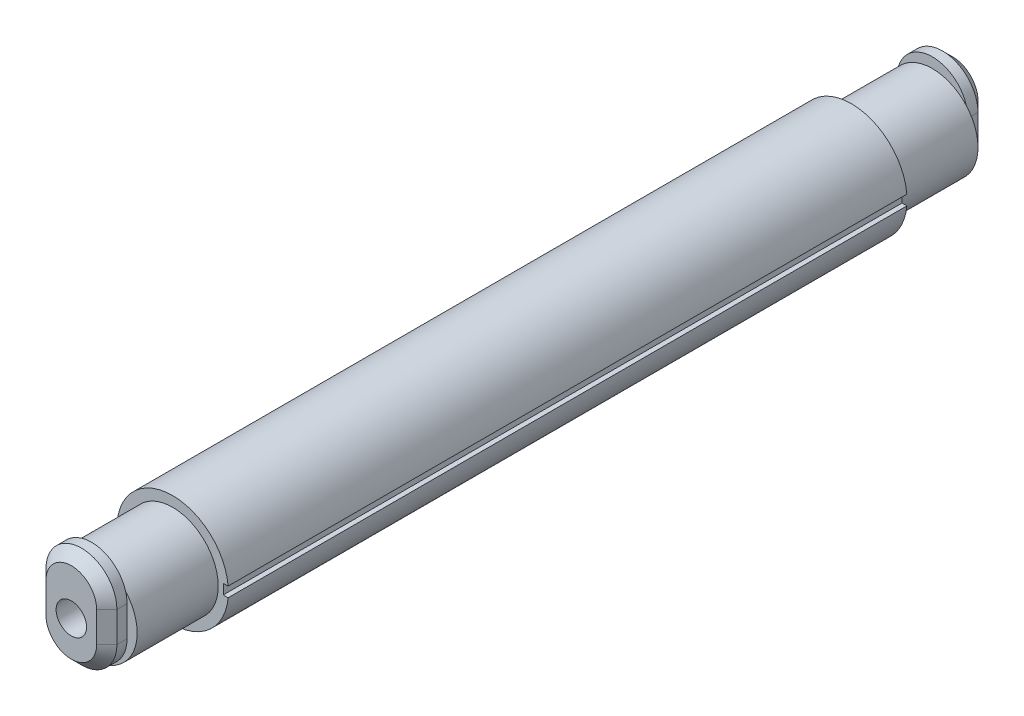
ISO-10303-21;
HEADER;
FILE_DESCRIPTION(('STEP AP214'),'2;1');
FILE_NAME('part.step','',(''),(''),'','','');
FILE_SCHEMA(('AUTOMOTIVE_DESIGN { 1 0 10303 214 1 1 1 1 }'));
ENDSEC;
DATA;
#1=APPLICATION_CONTEXT('core data for automotive mechanical design processes');
#2=APPLICATION_PROTOCOL_DEFINITION('international standard','automotive_design',2000,#1);
#3=PRODUCT_CONTEXT('',#1,'mechanical');
#4=PRODUCT('Part','Part','',(#3));
#5=PRODUCT_RELATED_PRODUCT_CATEGORY('part','',(#4));
#6=PRODUCT_DEFINITION_FORMATION('','',#4);
#7=PRODUCT_DEFINITION_CONTEXT('part definition',#1,'design');
#8=PRODUCT_DEFINITION('design','',#6,#7);
#9=PRODUCT_DEFINITION_SHAPE('','',#8);
#10=(LENGTH_UNIT() NAMED_UNIT(*) SI_UNIT(.MILLI.,.METRE.));
#11=(NAMED_UNIT(*) PLANE_ANGLE_UNIT() SI_UNIT($,.RADIAN.));
#12=(NAMED_UNIT(*) SI_UNIT($,.STERADIAN.) SOLID_ANGLE_UNIT());
#13=UNCERTAINTY_MEASURE_WITH_UNIT(LENGTH_MEASURE(1.E-05),#10,'distance_accuracy_value','');
#14=(GEOMETRIC_REPRESENTATION_CONTEXT(3) GLOBAL_UNCERTAINTY_ASSIGNED_CONTEXT((#13)) GLOBAL_UNIT_ASSIGNED_CONTEXT((#10,
#11,#12)) REPRESENTATION_CONTEXT('',''));
#15=CARTESIAN_POINT('',(0.,0.,0.));
#16=DIRECTION('',(0.,0.,1.));
#17=DIRECTION('',(1.,0.,0.));
#18=AXIS2_PLACEMENT_3D('',#15,#16,#17);
#19=CARTESIAN_POINT('',(0.,0.,-8.));
#20=DIRECTION('',(0.,0.,-1.));
#21=DIRECTION('',(1.,0.,0.));
#22=AXIS2_PLACEMENT_3D('',#19,#20,#21);
#23=PLANE('',#22);
#24=DIRECTION('',(0.,1.,0.));
#25=VECTOR('',#24,1.);
#26=CARTESIAN_POINT('',(3.5,-0.992829401379001,-8.00000000000001));
#27=LINE('',#26,#25);
#28=CARTESIAN_POINT('',(3.5,-0.992829401379001,-8.00000000000001));
#29=VERTEX_POINT('',#28);
#30=CARTESIAN_POINT('',(3.5,2.007170598621,-8.00000000000001));
#31=VERTEX_POINT('',#30);
#32=EDGE_CURVE('E233',#29,#31,#27,.T.);
#33=ORIENTED_EDGE('',*,*,#32,.T.);
#34=CARTESIAN_POINT('',(0.,2.007170598621,-8.00000000000001));
#35=DIRECTION('',(0.,0.,1.));
#36=DIRECTION('',(1.,0.,0.));
#37=AXIS2_PLACEMENT_3D('',#34,#35,#36);
#38=CIRCLE('',#37,3.5);
#39=CARTESIAN_POINT('',(3.35728244613644,2.99644031758754,-8.00000000000001));
#40=VERTEX_POINT('',#39);
#41=EDGE_CURVE('E222',#31,#40,#38,.T.);
#42=ORIENTED_EDGE('',*,*,#41,.T.);
#43=CARTESIAN_POINT('',(0.,0.,-8.));
#44=DIRECTION('',(0.,0.,1.));
#45=DIRECTION('',(1.,0.,0.));
#46=AXIS2_PLACEMENT_3D('',#43,#44,#45);
#47=CIRCLE('',#46,4.5);
#48=CARTESIAN_POINT('',(-3.35728244613644,2.99644031758754,-8.00000000000001));
#49=VERTEX_POINT('',#48);
#50=EDGE_CURVE('E216',#49,#40,#47,.T.);
#51=ORIENTED_EDGE('',*,*,#50,.F.);
#52=CARTESIAN_POINT('',(-3.5,2.007170598621,-8.00000000000001));
#53=VERTEX_POINT('',#52);
#54=EDGE_CURVE('E196',#49,#53,#38,.T.);
#55=ORIENTED_EDGE('',*,*,#54,.T.);
#56=DIRECTION('',(0.,-1.,0.));
#57=VECTOR('',#56,1.);
#58=CARTESIAN_POINT('',(-3.5,-0.992829401379001,-8.00000000000001));
#59=LINE('',#58,#57);
#60=CARTESIAN_POINT('',(-3.5,-0.992829401379001,-8.00000000000001));
#61=VERTEX_POINT('',#60);
#62=EDGE_CURVE('E203',#53,#61,#59,.T.);
#63=ORIENTED_EDGE('',*,*,#62,.T.);
#64=CARTESIAN_POINT('',(0.,-0.992829401379001,-8.00000000000001));
#65=DIRECTION('',(0.,0.,1.));
#66=DIRECTION('',(1.,0.,0.));
#67=AXIS2_PLACEMENT_3D('',#64,#65,#66);
#68=CIRCLE('',#67,3.5);
#69=EDGE_CURVE('E210',#61,#29,#68,.T.);
#70=ORIENTED_EDGE('',*,*,#69,.T.);
#71=EDGE_LOOP('',(#33,#42,#51,#55,#63,#70));
#72=FACE_BOUND('',#71,.T.);
#73=ADVANCED_FACE('F42',(#72),#23,.T.);
#74=CARTESIAN_POINT('',(0.,0.,67.));
#75=DIRECTION('',(0.,0.,-1.));
#76=DIRECTION('',(-1.,0.,0.));
#77=AXIS2_PLACEMENT_3D('',#74,#75,#76);
#78=CYLINDRICAL_SURFACE('',#77,5.5);
#79=CARTESIAN_POINT('',(0.,0.,67.));
#80=DIRECTION('',(0.,0.,1.));
#81=DIRECTION('',(1.,0.,0.));
#82=AXIS2_PLACEMENT_3D('',#79,#80,#81);
#83=CIRCLE('',#82,5.5);
#84=CARTESIAN_POINT('',(-5.47722557505166,-0.5,67.));
#85=VERTEX_POINT('',#84);
#86=CARTESIAN_POINT('',(5.47722557505166,-0.5,67.));
#87=VERTEX_POINT('',#86);
#88=EDGE_CURVE('E369',#85,#87,#83,.T.);
#89=ORIENTED_EDGE('',*,*,#88,.F.);
#90=DIRECTION('',(0.,0.,-1.));
#91=VECTOR('',#90,1.);
#92=CARTESIAN_POINT('',(-5.47722557505166,-0.5,67.));
#93=LINE('',#92,#91);
#94=CARTESIAN_POINT('',(-5.47722557505166,-0.5,0.));
#95=VERTEX_POINT('',#94);
#96=EDGE_CURVE('E359',#85,#95,#93,.T.);
#97=ORIENTED_EDGE('',*,*,#96,.T.);
#98=CARTESIAN_POINT('',(0.,0.,0.));
#99=DIRECTION('',(0.,0.,1.));
#100=DIRECTION('',(1.,0.,0.));
#101=AXIS2_PLACEMENT_3D('',#98,#99,#100);
#102=CIRCLE('',#101,5.5);
#103=CARTESIAN_POINT('',(5.47722557505166,-0.5,0.));
#104=VERTEX_POINT('',#103);
#105=EDGE_CURVE('E363',#95,#104,#102,.T.);
#106=ORIENTED_EDGE('',*,*,#105,.T.);
#107=DIRECTION('',(0.,0.,-1.));
#108=VECTOR('',#107,1.);
#109=CARTESIAN_POINT('',(5.47722557505166,-0.5,67.));
#110=LINE('',#109,#108);
#111=EDGE_CURVE('E351',#104,#87,#110,.F.);
#112=ORIENTED_EDGE('',*,*,#111,.T.);
#113=EDGE_LOOP('',(#89,#97,#106,#112));
#114=FACE_BOUND('',#113,.T.);
#115=ADVANCED_FACE('F506',(#114),#78,.T.);
#116=CARTESIAN_POINT('',(5.47722557505166,0.5,0.));
#117=VERTEX_POINT('',#116);
#118=CARTESIAN_POINT('',(-5.47722557505166,0.5,0.));
#119=VERTEX_POINT('',#118);
#120=EDGE_CURVE('E370',#117,#119,#102,.T.);
#121=ORIENTED_EDGE('',*,*,#120,.T.);
#122=DIRECTION('',(0.,0.,-1.));
#123=VECTOR('',#122,1.);
#124=CARTESIAN_POINT('',(-5.47722557505166,0.5,67.));
#125=LINE('',#124,#123);
#126=CARTESIAN_POINT('',(-5.47722557505166,0.5,67.));
#127=VERTEX_POINT('',#126);
#128=EDGE_CURVE('E355',#119,#127,#125,.F.);
#129=ORIENTED_EDGE('',*,*,#128,.T.);
#130=CARTESIAN_POINT('',(5.47722557505166,0.5,67.));
#131=VERTEX_POINT('',#130);
#132=EDGE_CURVE('E364',#131,#127,#83,.T.);
#133=ORIENTED_EDGE('',*,*,#132,.F.);
#134=DIRECTION('',(0.,0.,-1.));
#135=VECTOR('',#134,1.);
#136=CARTESIAN_POINT('',(5.47722557505166,0.5,67.));
#137=LINE('',#136,#135);
#138=EDGE_CURVE('E320',#131,#117,#137,.T.);
#139=ORIENTED_EDGE('',*,*,#138,.T.);
#140=EDGE_LOOP('',(#121,#129,#133,#139));
#141=FACE_BOUND('',#140,.T.);
#142=ADVANCED_FACE('F511',(#141),#78,.T.);
#143=CARTESIAN_POINT('',(0.,0.,67.));
#144=DIRECTION('',(0.,0.,1.));
#145=DIRECTION('',(1.,0.,0.));
#146=AXIS2_PLACEMENT_3D('',#143,#144,#145);
#147=PLANE('',#146);
#148=CARTESIAN_POINT('',(0.,0.,67.));
#149=DIRECTION('',(0.,0.,1.));
#150=DIRECTION('',(1.,0.,0.));
#151=AXIS2_PLACEMENT_3D('',#148,#149,#150);
#152=CIRCLE('',#151,4.5);
#153=CARTESIAN_POINT('',(4.5,0.,67.));
#154=VERTEX_POINT('',#153);
#155=EDGE_CURVE('E286',#154,#154,#152,.T.);
#156=ORIENTED_EDGE('',*,*,#155,.F.);
#157=EDGE_LOOP('',(#156));
#158=FACE_BOUND('',#157,.T.);
#159=DIRECTION('',(-1.,0.,0.));
#160=VECTOR('',#159,1.);
#161=CARTESIAN_POINT('',(-5.,-0.5,67.));
#162=LINE('',#161,#160);
#163=CARTESIAN_POINT('',(-5.,-0.5,67.));
#164=VERTEX_POINT('',#163);
#165=EDGE_CURVE('E305',#164,#85,#162,.T.);
#166=ORIENTED_EDGE('',*,*,#165,.T.);
#167=ORIENTED_EDGE('',*,*,#88,.T.);
#168=DIRECTION('',(-1.,0.,0.));
#169=VECTOR('',#168,1.);
#170=CARTESIAN_POINT('',(6.,-0.5,67.));
#171=LINE('',#170,#169);
#172=CARTESIAN_POINT('',(5.,-0.5,67.));
#173=VERTEX_POINT('',#172);
#174=EDGE_CURVE('E333',#87,#173,#171,.T.);
#175=ORIENTED_EDGE('',*,*,#174,.T.);
#176=DIRECTION('',(0.,1.,0.));
#177=VECTOR('',#176,1.);
#178=CARTESIAN_POINT('',(5.,0.5,67.));
#179=LINE('',#178,#177);
#180=CARTESIAN_POINT('',(5.,0.5,67.));
#181=VERTEX_POINT('',#180);
#182=EDGE_CURVE('E324',#173,#181,#179,.T.);
#183=ORIENTED_EDGE('',*,*,#182,.T.);
#184=DIRECTION('',(1.,0.,0.));
#185=VECTOR('',#184,1.);
#186=CARTESIAN_POINT('',(6.,0.5,67.));
#187=LINE('',#186,#185);
#188=EDGE_CURVE('E328',#181,#131,#187,.T.);
#189=ORIENTED_EDGE('',*,*,#188,.T.);
#190=ORIENTED_EDGE('',*,*,#132,.T.);
#191=DIRECTION('',(1.,0.,0.));
#192=VECTOR('',#191,1.);
#193=CARTESIAN_POINT('',(-5.,0.5,67.));
#194=LINE('',#193,#192);
#195=CARTESIAN_POINT('',(-5.,0.5,67.));
#196=VERTEX_POINT('',#195);
#197=EDGE_CURVE('E296',#127,#196,#194,.T.);
#198=ORIENTED_EDGE('',*,*,#197,.T.);
#199=DIRECTION('',(0.,-1.,0.));
#200=VECTOR('',#199,1.);
#201=CARTESIAN_POINT('',(-5.,0.5,67.));
#202=LINE('',#201,#200);
#203=EDGE_CURVE('E300',#196,#164,#202,.T.);
#204=ORIENTED_EDGE('',*,*,#203,.T.);
#205=EDGE_LOOP('',(#166,#167,#175,#183,#189,#190,#198,#204));
#206=FACE_BOUND('',#205,.T.);
#207=ADVANCED_FACE('F578',(#158,#206),#147,.T.);
#208=CARTESIAN_POINT('',(0.,0.,0.));
#209=DIRECTION('',(0.,0.,1.));
#210=DIRECTION('',(1.,0.,0.));
#211=AXIS2_PLACEMENT_3D('',#208,#209,#210);
#212=PLANE('',#211);
#213=CARTESIAN_POINT('',(0.,0.,0.));
#214=DIRECTION('',(0.,0.,1.));
#215=DIRECTION('',(1.,0.,0.));
#216=AXIS2_PLACEMENT_3D('',#213,#214,#215);
#217=CIRCLE('',#216,4.5);
#218=CARTESIAN_POINT('',(4.5,0.,0.));
#219=VERTEX_POINT('',#218);
#220=EDGE_CURVE('E245',#219,#219,#217,.T.);
#221=ORIENTED_EDGE('',*,*,#220,.T.);
#222=EDGE_LOOP('',(#221));
#223=FACE_BOUND('',#222,.T.);
#224=ORIENTED_EDGE('',*,*,#105,.F.);
#225=DIRECTION('',(-1.,0.,0.));
#226=VECTOR('',#225,1.);
#227=CARTESIAN_POINT('',(-5.,-0.5,0.));
#228=LINE('',#227,#226);
#229=CARTESIAN_POINT('',(-5.,-0.5,0.));
#230=VERTEX_POINT('',#229);
#231=EDGE_CURVE('E301',#230,#95,#228,.T.);
#232=ORIENTED_EDGE('',*,*,#231,.F.);
#233=DIRECTION('',(0.,-1.,0.));
#234=VECTOR('',#233,1.);
#235=CARTESIAN_POINT('',(-5.,0.5,0.));
#236=LINE('',#235,#234);
#237=CARTESIAN_POINT('',(-5.,0.5,0.));
#238=VERTEX_POINT('',#237);
#239=EDGE_CURVE('E310',#238,#230,#236,.T.);
#240=ORIENTED_EDGE('',*,*,#239,.F.);
#241=DIRECTION('',(-1.,0.,0.));
#242=VECTOR('',#241,1.);
#243=CARTESIAN_POINT('',(0.,0.5,0.));
#244=LINE('',#243,#242);
#245=EDGE_CURVE('E377',#238,#119,#244,.T.);
#246=ORIENTED_EDGE('',*,*,#245,.T.);
#247=ORIENTED_EDGE('',*,*,#120,.F.);
#248=DIRECTION('',(1.,0.,0.));
#249=VECTOR('',#248,1.);
#250=CARTESIAN_POINT('',(6.,0.5,0.));
#251=LINE('',#250,#249);
#252=CARTESIAN_POINT('',(5.,0.5,0.));
#253=VERTEX_POINT('',#252);
#254=EDGE_CURVE('E329',#253,#117,#251,.T.);
#255=ORIENTED_EDGE('',*,*,#254,.F.);
#256=DIRECTION('',(0.,1.,0.));
#257=VECTOR('',#256,1.);
#258=CARTESIAN_POINT('',(5.,0.5,0.));
#259=LINE('',#258,#257);
#260=CARTESIAN_POINT('',(5.,-0.5,0.));
#261=VERTEX_POINT('',#260);
#262=EDGE_CURVE('E291',#261,#253,#259,.T.);
#263=ORIENTED_EDGE('',*,*,#262,.F.);
#264=DIRECTION('',(1.,0.,0.));
#265=VECTOR('',#264,1.);
#266=CARTESIAN_POINT('',(0.,-0.5,0.));
#267=LINE('',#266,#265);
#268=EDGE_CURVE('E368',#261,#104,#267,.T.);
#269=ORIENTED_EDGE('',*,*,#268,.T.);
#270=EDGE_LOOP('',(#224,#232,#240,#246,#247,#255,#263,#269));
#271=FACE_BOUND('',#270,.T.);
#272=ADVANCED_FACE('F570',(#223,#271),#212,.F.);
#273=CARTESIAN_POINT('',(6.,-0.5,67.));
#274=DIRECTION('',(0.,-1.,0.));
#275=DIRECTION('',(0.,0.,-1.));
#276=AXIS2_PLACEMENT_3D('',#273,#274,#275);
#277=PLANE('',#276);
#278=ORIENTED_EDGE('',*,*,#268,.F.);
#279=DIRECTION('',(0.,0.,-1.));
#280=VECTOR('',#279,1.);
#281=CARTESIAN_POINT('',(5.,-0.5,67.));
#282=LINE('',#281,#280);
#283=EDGE_CURVE('E314',#173,#261,#282,.T.);
#284=ORIENTED_EDGE('',*,*,#283,.F.);
#285=ORIENTED_EDGE('',*,*,#174,.F.);
#286=ORIENTED_EDGE('',*,*,#111,.F.);
#287=EDGE_LOOP('',(#278,#284,#285,#286));
#288=FACE_BOUND('',#287,.T.);
#289=ADVANCED_FACE('F566',(#288),#277,.F.);
#290=CARTESIAN_POINT('',(6.,0.5,67.));
#291=DIRECTION('',(0.,1.,0.));
#292=DIRECTION('',(0.,0.,1.));
#293=AXIS2_PLACEMENT_3D('',#290,#291,#292);
#294=PLANE('',#293);
#295=ORIENTED_EDGE('',*,*,#188,.F.);
#296=DIRECTION('',(0.,0.,-1.));
#297=VECTOR('',#296,1.);
#298=CARTESIAN_POINT('',(5.,0.5,67.));
#299=LINE('',#298,#297);
#300=EDGE_CURVE('E337',#181,#253,#299,.T.);
#301=ORIENTED_EDGE('',*,*,#300,.T.);
#302=ORIENTED_EDGE('',*,*,#254,.T.);
#303=ORIENTED_EDGE('',*,*,#138,.F.);
#304=EDGE_LOOP('',(#295,#301,#302,#303));
#305=FACE_BOUND('',#304,.T.);
#306=ADVANCED_FACE('F569',(#305),#294,.F.);
#307=CARTESIAN_POINT('',(5.,0.5,67.));
#308=DIRECTION('',(-1.,0.,0.));
#309=DIRECTION('',(0.,0.,1.));
#310=AXIS2_PLACEMENT_3D('',#307,#308,#309);
#311=PLANE('',#310);
#312=ORIENTED_EDGE('',*,*,#262,.T.);
#313=ORIENTED_EDGE('',*,*,#300,.F.);
#314=ORIENTED_EDGE('',*,*,#182,.F.);
#315=ORIENTED_EDGE('',*,*,#283,.T.);
#316=EDGE_LOOP('',(#312,#313,#314,#315));
#317=FACE_BOUND('',#316,.T.);
#318=ADVANCED_FACE('F558',(#317),#311,.F.);
#319=CARTESIAN_POINT('',(-5.,-0.5,67.));
#320=DIRECTION('',(0.,-1.,0.));
#321=DIRECTION('',(0.,0.,-1.));
#322=AXIS2_PLACEMENT_3D('',#319,#320,#321);
#323=PLANE('',#322);
#324=ORIENTED_EDGE('',*,*,#165,.F.);
#325=DIRECTION('',(0.,0.,-1.));
#326=VECTOR('',#325,1.);
#327=CARTESIAN_POINT('',(-5.,-0.5,67.));
#328=LINE('',#327,#326);
#329=EDGE_CURVE('E317',#164,#230,#328,.T.);
#330=ORIENTED_EDGE('',*,*,#329,.T.);
#331=ORIENTED_EDGE('',*,*,#231,.T.);
#332=ORIENTED_EDGE('',*,*,#96,.F.);
#333=EDGE_LOOP('',(#324,#330,#331,#332));
#334=FACE_BOUND('',#333,.T.);
#335=ADVANCED_FACE('F554',(#334),#323,.F.);
#336=CARTESIAN_POINT('',(-5.,0.5,67.));
#337=DIRECTION('',(0.,1.,0.));
#338=DIRECTION('',(0.,0.,1.));
#339=AXIS2_PLACEMENT_3D('',#336,#337,#338);
#340=PLANE('',#339);
#341=ORIENTED_EDGE('',*,*,#245,.F.);
#342=DIRECTION('',(0.,0.,-1.));
#343=VECTOR('',#342,1.);
#344=CARTESIAN_POINT('',(-5.,0.5,67.));
#345=LINE('',#344,#343);
#346=EDGE_CURVE('E309',#196,#238,#345,.T.);
#347=ORIENTED_EDGE('',*,*,#346,.F.);
#348=ORIENTED_EDGE('',*,*,#197,.F.);
#349=ORIENTED_EDGE('',*,*,#128,.F.);
#350=EDGE_LOOP('',(#341,#347,#348,#349));
#351=FACE_BOUND('',#350,.T.);
#352=ADVANCED_FACE('F557',(#351),#340,.F.);
#353=CARTESIAN_POINT('',(-5.,0.5,67.));
#354=DIRECTION('',(1.,0.,0.));
#355=DIRECTION('',(0.,0.,-1.));
#356=AXIS2_PLACEMENT_3D('',#353,#354,#355);
#357=PLANE('',#356);
#358=ORIENTED_EDGE('',*,*,#239,.T.);
#359=ORIENTED_EDGE('',*,*,#329,.F.);
#360=ORIENTED_EDGE('',*,*,#203,.F.);
#361=ORIENTED_EDGE('',*,*,#346,.T.);
#362=EDGE_LOOP('',(#358,#359,#360,#361));
#363=FACE_BOUND('',#362,.T.);
#364=ADVANCED_FACE('F552',(#363),#357,.F.);
#365=CARTESIAN_POINT('',(0.,0.,75.));
#366=DIRECTION('',(0.,0.,-1.));
#367=DIRECTION('',(-1.,0.,0.));
#368=AXIS2_PLACEMENT_3D('',#365,#366,#367);
#369=CYLINDRICAL_SURFACE('',#368,4.5);
#370=CARTESIAN_POINT('',(0.,0.,75.));
#371=DIRECTION('',(0.,0.,1.));
#372=DIRECTION('',(1.,0.,0.));
#373=AXIS2_PLACEMENT_3D('',#370,#371,#372);
#374=CIRCLE('',#373,4.5);
#375=CARTESIAN_POINT('',(3.35728244613644,2.99644031758754,75.));
#376=VERTEX_POINT('',#375);
#377=CARTESIAN_POINT('',(-3.35728244613644,2.99644031758754,75.));
#378=VERTEX_POINT('',#377);
#379=EDGE_CURVE('E287',#376,#378,#374,.T.);
#380=ORIENTED_EDGE('',*,*,#379,.F.);
#381=EDGE_CURVE('E292',#378,#376,#374,.T.);
#382=ORIENTED_EDGE('',*,*,#381,.F.);
#383=EDGE_LOOP('',(#380,#382));
#384=FACE_BOUND('',#383,.T.);
#385=ORIENTED_EDGE('',*,*,#155,.T.);
#386=EDGE_LOOP('',(#385));
#387=FACE_BOUND('',#386,.T.);
#388=ADVANCED_FACE('F548',(#384,#387),#369,.T.);
#389=CARTESIAN_POINT('',(0.,0.,75.));
#390=DIRECTION('',(0.,0.,1.));
#391=DIRECTION('',(1.,0.,0.));
#392=AXIS2_PLACEMENT_3D('',#389,#390,#391);
#393=PLANE('',#392);
#394=CARTESIAN_POINT('',(0.,2.007170598621,75.));
#395=DIRECTION('',(0.,0.,1.));
#396=DIRECTION('',(1.,0.,0.));
#397=AXIS2_PLACEMENT_3D('',#394,#395,#396);
#398=CIRCLE('',#397,3.5);
#399=CARTESIAN_POINT('',(-3.5,2.007170598621,75.));
#400=VERTEX_POINT('',#399);
#401=EDGE_CURVE('E270',#378,#400,#398,.T.);
#402=ORIENTED_EDGE('',*,*,#401,.F.);
#403=ORIENTED_EDGE('',*,*,#381,.T.);
#404=CARTESIAN_POINT('',(3.5,2.007170598621,75.));
#405=VERTEX_POINT('',#404);
#406=EDGE_CURVE('E265',#405,#376,#398,.T.);
#407=ORIENTED_EDGE('',*,*,#406,.F.);
#408=DIRECTION('',(0.,1.,0.));
#409=VECTOR('',#408,1.);
#410=CARTESIAN_POINT('',(3.5,-0.992829401379001,75.));
#411=LINE('',#410,#409);
#412=CARTESIAN_POINT('',(3.5,-0.992829401379001,75.));
#413=VERTEX_POINT('',#412);
#414=EDGE_CURVE('E259',#413,#405,#411,.T.);
#415=ORIENTED_EDGE('',*,*,#414,.F.);
#416=CARTESIAN_POINT('',(0.,-0.992829401379001,75.));
#417=DIRECTION('',(0.,0.,1.));
#418=DIRECTION('',(1.,0.,0.));
#419=AXIS2_PLACEMENT_3D('',#416,#417,#418);
#420=CIRCLE('',#419,3.5);
#421=CARTESIAN_POINT('',(-3.5,-0.992829401379001,75.));
#422=VERTEX_POINT('',#421);
#423=EDGE_CURVE('E255',#422,#413,#420,.T.);
#424=ORIENTED_EDGE('',*,*,#423,.F.);
#425=DIRECTION('',(0.,-1.,0.));
#426=VECTOR('',#425,1.);
#427=CARTESIAN_POINT('',(-3.5,-0.992829401379001,75.));
#428=LINE('',#427,#426);
#429=EDGE_CURVE('E269',#400,#422,#428,.T.);
#430=ORIENTED_EDGE('',*,*,#429,.F.);
#431=EDGE_LOOP('',(#402,#403,#407,#415,#424,#430));
#432=FACE_BOUND('',#431,.T.);
#433=ADVANCED_FACE('F530',(#432),#393,.T.);
#434=CARTESIAN_POINT('',(0.,-0.992829401379001,75.));
#435=DIRECTION('',(0.,0.,1.));
#436=DIRECTION('',(1.,0.,0.));
#437=AXIS2_PLACEMENT_3D('',#434,#435,#436);
#438=PLANE('',#437);
#439=EDGE_CURVE('E264',#376,#378,#398,.T.);
#440=ORIENTED_EDGE('',*,*,#439,.F.);
#441=ORIENTED_EDGE('',*,*,#379,.T.);
#442=EDGE_LOOP('',(#440,#441));
#443=FACE_BOUND('',#442,.T.);
#444=ADVANCED_FACE('F526',(#443),#438,.F.);
#445=CARTESIAN_POINT('',(0.,-0.992829401379001,77.));
#446=DIRECTION('',(0.,0.,-1.));
#447=DIRECTION('',(-1.,0.,0.));
#448=AXIS2_PLACEMENT_3D('',#445,#446,#447);
#449=CYLINDRICAL_SURFACE('',#448,3.5);
#450=DIRECTION('',(0.,0.,-1.));
#451=VECTOR('',#450,1.);
#452=CARTESIAN_POINT('',(3.5,-0.992829401379001,77.));
#453=LINE('',#452,#451);
#454=CARTESIAN_POINT('',(3.5,-0.992829401379001,76.));
#455=VERTEX_POINT('',#454);
#456=EDGE_CURVE('E283',#455,#413,#453,.T.);
#457=ORIENTED_EDGE('',*,*,#456,.F.);
#458=CARTESIAN_POINT('',(0.,-0.992829401379001,76.));
#459=DIRECTION('',(0.,0.,1.));
#460=DIRECTION('',(1.,0.,0.));
#461=AXIS2_PLACEMENT_3D('',#458,#459,#460);
#462=CIRCLE('',#461,3.5);
#463=CARTESIAN_POINT('',(-3.5,-0.992829401379001,76.));
#464=VERTEX_POINT('',#463);
#465=EDGE_CURVE('E229',#455,#464,#462,.F.);
#466=ORIENTED_EDGE('',*,*,#465,.T.);
#467=DIRECTION('',(0.,0.,-1.));
#468=VECTOR('',#467,1.);
#469=CARTESIAN_POINT('',(-3.5,-0.992829401379001,77.));
#470=LINE('',#469,#468);
#471=EDGE_CURVE('E274',#464,#422,#470,.T.);
#472=ORIENTED_EDGE('',*,*,#471,.T.);
#473=ORIENTED_EDGE('',*,*,#423,.T.);
#474=EDGE_LOOP('',(#457,#466,#472,#473));
#475=FACE_BOUND('',#474,.T.);
#476=ADVANCED_FACE('F529',(#475),#449,.T.);
#477=CARTESIAN_POINT('',(3.5,-0.992829401379001,77.));
#478=DIRECTION('',(-1.,0.,0.));
#479=DIRECTION('',(0.,-1.,0.));
#480=AXIS2_PLACEMENT_3D('',#477,#478,#479);
#481=PLANE('',#480);
#482=DIRECTION('',(0.,0.,-1.));
#483=VECTOR('',#482,1.);
#484=CARTESIAN_POINT('',(3.5,2.007170598621,77.));
#485=LINE('',#484,#483);
#486=CARTESIAN_POINT('',(3.5,2.007170598621,76.));
#487=VERTEX_POINT('',#486);
#488=EDGE_CURVE('E280',#487,#405,#485,.T.);
#489=ORIENTED_EDGE('',*,*,#488,.F.);
#490=DIRECTION('',(0.,-1.,0.));
#491=VECTOR('',#490,1.);
#492=CARTESIAN_POINT('',(3.5,-0.992829401379001,76.));
#493=LINE('',#492,#491);
#494=EDGE_CURVE('E394',#487,#455,#493,.T.);
#495=ORIENTED_EDGE('',*,*,#494,.T.);
#496=ORIENTED_EDGE('',*,*,#456,.T.);
#497=ORIENTED_EDGE('',*,*,#414,.T.);
#498=EDGE_LOOP('',(#489,#495,#496,#497));
#499=FACE_BOUND('',#498,.T.);
#500=ADVANCED_FACE('F538',(#499),#481,.F.);
#501=CARTESIAN_POINT('',(0.,2.007170598621,77.));
#502=DIRECTION('',(0.,0.,-1.));
#503=DIRECTION('',(-1.,0.,0.));
#504=AXIS2_PLACEMENT_3D('',#501,#502,#503);
#505=CYLINDRICAL_SURFACE('',#504,3.5);
#506=DIRECTION('',(0.,0.,-1.));
#507=VECTOR('',#506,1.);
#508=CARTESIAN_POINT('',(-3.5,2.007170598621,77.));
#509=LINE('',#508,#507);
#510=CARTESIAN_POINT('',(-3.5,2.007170598621,76.));
#511=VERTEX_POINT('',#510);
#512=EDGE_CURVE('E277',#511,#400,#509,.T.);
#513=ORIENTED_EDGE('',*,*,#512,.F.);
#514=CARTESIAN_POINT('',(0.,2.007170598621,76.));
#515=DIRECTION('',(0.,0.,1.));
#516=DIRECTION('',(1.,0.,0.));
#517=AXIS2_PLACEMENT_3D('',#514,#515,#516);
#518=CIRCLE('',#517,3.5);
#519=EDGE_CURVE('E398',#511,#487,#518,.F.);
#520=ORIENTED_EDGE('',*,*,#519,.T.);
#521=ORIENTED_EDGE('',*,*,#488,.T.);
#522=ORIENTED_EDGE('',*,*,#406,.T.);
#523=ORIENTED_EDGE('',*,*,#439,.T.);
#524=ORIENTED_EDGE('',*,*,#401,.T.);
#525=EDGE_LOOP('',(#513,#520,#521,#522,#523,#524));
#526=FACE_BOUND('',#525,.T.);
#527=ADVANCED_FACE('F534',(#526),#505,.T.);
#528=CARTESIAN_POINT('',(-3.5,-0.992829401379001,77.));
#529=DIRECTION('',(1.,0.,0.));
#530=DIRECTION('',(0.,1.,0.));
#531=AXIS2_PLACEMENT_3D('',#528,#529,#530);
#532=PLANE('',#531);
#533=ORIENTED_EDGE('',*,*,#471,.F.);
#534=DIRECTION('',(0.,1.,0.));
#535=VECTOR('',#534,1.);
#536=CARTESIAN_POINT('',(-3.5,2.007170598621,76.));
#537=LINE('',#536,#535);
#538=EDGE_CURVE('E220',#464,#511,#537,.T.);
#539=ORIENTED_EDGE('',*,*,#538,.T.);
#540=ORIENTED_EDGE('',*,*,#512,.T.);
#541=ORIENTED_EDGE('',*,*,#429,.T.);
#542=EDGE_LOOP('',(#533,#539,#540,#541));
#543=FACE_BOUND('',#542,.T.);
#544=ADVANCED_FACE('F524',(#543),#532,.F.);
#545=CARTESIAN_POINT('',(0.,-0.992829401379001,77.));
#546=DIRECTION('',(0.,0.,1.));
#547=DIRECTION('',(1.,0.,0.));
#548=AXIS2_PLACEMENT_3D('',#545,#546,#547);
#549=PLANE('',#548);
#550=CARTESIAN_POINT('',(0.,0.,77.));
#551=DIRECTION('',(0.,0.,-1.));
#552=DIRECTION('',(-1.,0.,0.));
#553=AXIS2_PLACEMENT_3D('',#550,#551,#552);
#554=CIRCLE('',#553,1.49999999999998);
#555=CARTESIAN_POINT('',(-1.49999999999998,0.,77.));
#556=VERTEX_POINT('',#555);
#557=EDGE_CURVE('E435',#556,#556,#554,.T.);
#558=ORIENTED_EDGE('',*,*,#557,.T.);
#559=EDGE_LOOP('',(#558));
#560=FACE_BOUND('',#559,.T.);
#561=CARTESIAN_POINT('',(0.,-0.992829401379001,77.));
#562=DIRECTION('',(0.,0.,1.));
#563=DIRECTION('',(1.,0.,0.));
#564=AXIS2_PLACEMENT_3D('',#561,#562,#563);
#565=CIRCLE('',#564,2.5);
#566=CARTESIAN_POINT('',(-2.5,-0.992829401379001,77.));
#567=VERTEX_POINT('',#566);
#568=CARTESIAN_POINT('',(2.5,-0.992829401379,77.));
#569=VERTEX_POINT('',#568);
#570=EDGE_CURVE('E384',#567,#569,#565,.T.);
#571=ORIENTED_EDGE('',*,*,#570,.T.);
#572=DIRECTION('',(0.,1.,0.));
#573=VECTOR('',#572,1.);
#574=CARTESIAN_POINT('',(2.5,2.007170598621,77.));
#575=LINE('',#574,#573);
#576=CARTESIAN_POINT('',(2.5,2.007170598621,77.));
#577=VERTEX_POINT('',#576);
#578=EDGE_CURVE('E390',#569,#577,#575,.T.);
#579=ORIENTED_EDGE('',*,*,#578,.T.);
#580=CARTESIAN_POINT('',(0.,2.007170598621,77.));
#581=DIRECTION('',(0.,0.,1.));
#582=DIRECTION('',(1.,0.,0.));
#583=AXIS2_PLACEMENT_3D('',#580,#581,#582);
#584=CIRCLE('',#583,2.5);
#585=CARTESIAN_POINT('',(-2.5,2.007170598621,77.));
#586=VERTEX_POINT('',#585);
#587=EDGE_CURVE('E387',#577,#586,#584,.T.);
#588=ORIENTED_EDGE('',*,*,#587,.T.);
#589=DIRECTION('',(0.,-1.,0.));
#590=VECTOR('',#589,1.);
#591=CARTESIAN_POINT('',(-2.5,-0.992829401379001,77.));
#592=LINE('',#591,#590);
#593=EDGE_CURVE('E381',#586,#567,#592,.T.);
#594=ORIENTED_EDGE('',*,*,#593,.T.);
#595=EDGE_LOOP('',(#571,#579,#588,#594));
#596=FACE_BOUND('',#595,.T.);
#597=ADVANCED_FACE('F520',(#560,#596),#549,.T.);
#598=CARTESIAN_POINT('',(-2.5,-0.992829401379001,77.));
#599=DIRECTION('',(-0.707106781186547,0.,0.707106781186547));
#600=DIRECTION('',(0.,1.,0.));
#601=AXIS2_PLACEMENT_3D('',#598,#599,#600);
#602=PLANE('',#601);
#603=DIRECTION('',(0.707106781186547,0.,0.707106781186547));
#604=VECTOR('',#603,1.);
#605=CARTESIAN_POINT('',(-3.5,2.007170598621,76.));
#606=LINE('',#605,#604);
#607=EDGE_CURVE('E408',#511,#586,#606,.T.);
#608=ORIENTED_EDGE('',*,*,#607,.F.);
#609=ORIENTED_EDGE('',*,*,#538,.F.);
#610=DIRECTION('',(-0.707106781186547,0.,-0.707106781186547));
#611=VECTOR('',#610,1.);
#612=CARTESIAN_POINT('',(-2.5,-0.992829401379001,77.));
#613=LINE('',#612,#611);
#614=EDGE_CURVE('E260',#567,#464,#613,.T.);
#615=ORIENTED_EDGE('',*,*,#614,.F.);
#616=ORIENTED_EDGE('',*,*,#593,.F.);
#617=EDGE_LOOP('',(#608,#609,#615,#616));
#618=FACE_BOUND('',#617,.T.);
#619=ADVANCED_FACE('F523',(#618),#602,.T.);
#620=CARTESIAN_POINT('',(0.,-0.992829401379001,77.));
#621=DIRECTION('',(0.,0.,-1.));
#622=DIRECTION('',(-1.,0.,0.));
#623=AXIS2_PLACEMENT_3D('',#620,#621,#622);
#624=CONICAL_SURFACE('',#623,2.5,0.785398163397448);
#625=ORIENTED_EDGE('',*,*,#614,.T.);
#626=ORIENTED_EDGE('',*,*,#465,.F.);
#627=DIRECTION('',(0.707106781186547,0.,-0.707106781186547));
#628=VECTOR('',#627,1.);
#629=CARTESIAN_POINT('',(2.5,-0.992829401379,77.));
#630=LINE('',#629,#628);
#631=EDGE_CURVE('E405',#569,#455,#630,.T.);
#632=ORIENTED_EDGE('',*,*,#631,.F.);
#633=ORIENTED_EDGE('',*,*,#570,.F.);
#634=EDGE_LOOP('',(#625,#626,#632,#633));
#635=FACE_BOUND('',#634,.T.);
#636=ADVANCED_FACE('F600',(#635),#624,.T.);
#637=CARTESIAN_POINT('',(0.,2.007170598621,77.));
#638=DIRECTION('',(0.,0.,-1.));
#639=DIRECTION('',(-1.,0.,0.));
#640=AXIS2_PLACEMENT_3D('',#637,#638,#639);
#641=CONICAL_SURFACE('',#640,2.5,0.785398163397448);
#642=ORIENTED_EDGE('',*,*,#607,.T.);
#643=ORIENTED_EDGE('',*,*,#587,.F.);
#644=DIRECTION('',(-0.707106781186547,0.,0.707106781186547));
#645=VECTOR('',#644,1.);
#646=CARTESIAN_POINT('',(3.5,2.007170598621,76.));
#647=LINE('',#646,#645);
#648=EDGE_CURVE('E250',#487,#577,#647,.T.);
#649=ORIENTED_EDGE('',*,*,#648,.F.);
#650=ORIENTED_EDGE('',*,*,#519,.F.);
#651=EDGE_LOOP('',(#642,#643,#649,#650));
#652=FACE_BOUND('',#651,.T.);
#653=ADVANCED_FACE('F593',(#652),#641,.T.);
#654=CARTESIAN_POINT('',(2.5,-0.992829401379001,77.));
#655=DIRECTION('',(0.707106781186547,0.,0.707106781186547));
#656=DIRECTION('',(0.,-1.,0.));
#657=AXIS2_PLACEMENT_3D('',#654,#655,#656);
#658=PLANE('',#657);
#659=ORIENTED_EDGE('',*,*,#631,.T.);
#660=ORIENTED_EDGE('',*,*,#494,.F.);
#661=ORIENTED_EDGE('',*,*,#648,.T.);
#662=ORIENTED_EDGE('',*,*,#578,.F.);
#663=EDGE_LOOP('',(#659,#660,#661,#662));
#664=FACE_BOUND('',#663,.T.);
#665=ADVANCED_FACE('F519',(#664),#658,.T.);
#666=CARTESIAN_POINT('',(0.,0.,-8.));
#667=DIRECTION('',(0.,0.,1.));
#668=DIRECTION('',(1.,0.,0.));
#669=AXIS2_PLACEMENT_3D('',#666,#667,#668);
#670=CYLINDRICAL_SURFACE('',#669,4.5);
#671=EDGE_CURVE('E238',#40,#49,#47,.T.);
#672=ORIENTED_EDGE('',*,*,#671,.T.);
#673=ORIENTED_EDGE('',*,*,#50,.T.);
#674=EDGE_LOOP('',(#672,#673));
#675=FACE_BOUND('',#674,.T.);
#676=ORIENTED_EDGE('',*,*,#220,.F.);
#677=EDGE_LOOP('',(#676));
#678=FACE_BOUND('',#677,.T.);
#679=ADVANCED_FACE('F242',(#675,#678),#670,.T.);
#680=CARTESIAN_POINT('',(0.,-0.992829401379001,-10.));
#681=DIRECTION('',(0.,0.,1.));
#682=DIRECTION('',(1.,0.,0.));
#683=AXIS2_PLACEMENT_3D('',#680,#681,#682);
#684=CYLINDRICAL_SURFACE('',#683,3.5);
#685=DIRECTION('',(0.,0.,1.));
#686=VECTOR('',#685,1.);
#687=CARTESIAN_POINT('',(-3.5,-0.992829401379001,-10.));
#688=LINE('',#687,#686);
#689=CARTESIAN_POINT('',(-3.5,-0.992829401379001,-9.));
#690=VERTEX_POINT('',#689);
#691=EDGE_CURVE('E199',#690,#61,#688,.T.);
#692=ORIENTED_EDGE('',*,*,#691,.F.);
#693=CARTESIAN_POINT('',(0.,-0.992829401379001,-9.));
#694=DIRECTION('',(0.,0.,-1.));
#695=DIRECTION('',(-1.,0.,0.));
#696=AXIS2_PLACEMENT_3D('',#693,#694,#695);
#697=CIRCLE('',#696,3.5);
#698=CARTESIAN_POINT('',(3.5,-0.992829401379001,-9.));
#699=VERTEX_POINT('',#698);
#700=EDGE_CURVE('E53',#690,#699,#697,.F.);
#701=ORIENTED_EDGE('',*,*,#700,.T.);
#702=DIRECTION('',(0.,0.,1.));
#703=VECTOR('',#702,1.);
#704=CARTESIAN_POINT('',(3.5,-0.992829401379001,-10.));
#705=LINE('',#704,#703);
#706=EDGE_CURVE('E485',#699,#29,#705,.T.);
#707=ORIENTED_EDGE('',*,*,#706,.T.);
#708=ORIENTED_EDGE('',*,*,#69,.F.);
#709=EDGE_LOOP('',(#692,#701,#707,#708));
#710=FACE_BOUND('',#709,.T.);
#711=ADVANCED_FACE('F496',(#710),#684,.T.);
#712=CARTESIAN_POINT('',(-3.5,-0.992829401379001,-10.));
#713=DIRECTION('',(-1.,0.,0.));
#714=DIRECTION('',(0.,-1.,0.));
#715=AXIS2_PLACEMENT_3D('',#712,#713,#714);
#716=PLANE('',#715);
#717=DIRECTION('',(0.,0.,1.));
#718=VECTOR('',#717,1.);
#719=CARTESIAN_POINT('',(-3.5,2.007170598621,-10.));
#720=LINE('',#719,#718);
#721=CARTESIAN_POINT('',(-3.5,2.007170598621,-9.));
#722=VERTEX_POINT('',#721);
#723=EDGE_CURVE('E191',#722,#53,#720,.T.);
#724=ORIENTED_EDGE('',*,*,#723,.F.);
#725=DIRECTION('',(0.,-1.,0.));
#726=VECTOR('',#725,1.);
#727=CARTESIAN_POINT('',(-3.5,-0.992829401379001,-9.));
#728=LINE('',#727,#726);
#729=EDGE_CURVE('E11',#722,#690,#728,.T.);
#730=ORIENTED_EDGE('',*,*,#729,.T.);
#731=ORIENTED_EDGE('',*,*,#691,.T.);
#732=ORIENTED_EDGE('',*,*,#62,.F.);
#733=EDGE_LOOP('',(#724,#730,#731,#732));
#734=FACE_BOUND('',#733,.T.);
#735=ADVANCED_FACE('F204',(#734),#716,.T.);
#736=CARTESIAN_POINT('',(0.,2.007170598621,-10.));
#737=DIRECTION('',(0.,0.,1.));
#738=DIRECTION('',(1.,0.,0.));
#739=AXIS2_PLACEMENT_3D('',#736,#737,#738);
#740=CYLINDRICAL_SURFACE('',#739,3.5);
#741=DIRECTION('',(0.,0.,1.));
#742=VECTOR('',#741,1.);
#743=CARTESIAN_POINT('',(3.5,2.007170598621,-10.));
#744=LINE('',#743,#742);
#745=CARTESIAN_POINT('',(3.5,2.007170598621,-9.));
#746=VERTEX_POINT('',#745);
#747=EDGE_CURVE('E200',#746,#31,#744,.T.);
#748=ORIENTED_EDGE('',*,*,#747,.F.);
#749=CARTESIAN_POINT('',(0.,2.007170598621,-9.));
#750=DIRECTION('',(0.,0.,-1.));
#751=DIRECTION('',(-1.,0.,0.));
#752=AXIS2_PLACEMENT_3D('',#749,#750,#751);
#753=CIRCLE('',#752,3.5);
#754=EDGE_CURVE('E67',#746,#722,#753,.F.);
#755=ORIENTED_EDGE('',*,*,#754,.T.);
#756=ORIENTED_EDGE('',*,*,#723,.T.);
#757=ORIENTED_EDGE('',*,*,#54,.F.);
#758=EDGE_CURVE('E209',#40,#49,#38,.T.);
#759=ORIENTED_EDGE('',*,*,#758,.F.);
#760=ORIENTED_EDGE('',*,*,#41,.F.);
#761=EDGE_LOOP('',(#748,#755,#756,#757,#759,#760));
#762=FACE_BOUND('',#761,.T.);
#763=ADVANCED_FACE('F193',(#762),#740,.T.);
#764=CARTESIAN_POINT('',(3.5,-0.992829401379001,-10.));
#765=DIRECTION('',(1.,0.,0.));
#766=DIRECTION('',(0.,1.,0.));
#767=AXIS2_PLACEMENT_3D('',#764,#765,#766);
#768=PLANE('',#767);
#769=ORIENTED_EDGE('',*,*,#706,.F.);
#770=DIRECTION('',(0.,1.,0.));
#771=VECTOR('',#770,1.);
#772=CARTESIAN_POINT('',(3.5,-0.992829401379001,-9.));
#773=LINE('',#772,#771);
#774=EDGE_CURVE('E219',#699,#746,#773,.T.);
#775=ORIENTED_EDGE('',*,*,#774,.T.);
#776=ORIENTED_EDGE('',*,*,#747,.T.);
#777=ORIENTED_EDGE('',*,*,#32,.F.);
#778=EDGE_LOOP('',(#769,#775,#776,#777));
#779=FACE_BOUND('',#778,.T.);
#780=ADVANCED_FACE('F473',(#779),#768,.T.);
#781=CARTESIAN_POINT('',(0.,-0.992829401379001,-10.));
#782=DIRECTION('',(0.,0.,-1.));
#783=DIRECTION('',(1.,0.,0.));
#784=AXIS2_PLACEMENT_3D('',#781,#782,#783);
#785=PLANE('',#784);
#786=CARTESIAN_POINT('',(0.,0.,-10.));
#787=DIRECTION('',(0.,0.,-1.));
#788=DIRECTION('',(-1.,0.,0.));
#789=AXIS2_PLACEMENT_3D('',#786,#787,#788);
#790=CIRCLE('',#789,1.525);
#791=CARTESIAN_POINT('',(-1.525,0.,-10.));
#792=VERTEX_POINT('',#791);
#793=EDGE_CURVE('E462',#792,#792,#790,.T.);
#794=ORIENTED_EDGE('',*,*,#793,.F.);
#795=EDGE_LOOP('',(#794));
#796=FACE_BOUND('',#795,.T.);
#797=CARTESIAN_POINT('',(0.,2.007170598621,-10.));
#798=DIRECTION('',(0.,0.,-1.));
#799=DIRECTION('',(-1.,0.,0.));
#800=AXIS2_PLACEMENT_3D('',#797,#798,#799);
#801=CIRCLE('',#800,2.49999999999999);
#802=CARTESIAN_POINT('',(-2.49999999999999,2.007170598621,-10.));
#803=VERTEX_POINT('',#802);
#804=CARTESIAN_POINT('',(2.49999999999999,2.007170598621,-10.));
#805=VERTEX_POINT('',#804);
#806=EDGE_CURVE('E420',#803,#805,#801,.T.);
#807=ORIENTED_EDGE('',*,*,#806,.T.);
#808=DIRECTION('',(0.,-1.,0.));
#809=VECTOR('',#808,1.);
#810=CARTESIAN_POINT('',(2.49999999999999,-0.992829401379001,-10.));
#811=LINE('',#810,#809);
#812=CARTESIAN_POINT('',(2.49999999999999,-0.992829401379,-10.));
#813=VERTEX_POINT('',#812);
#814=EDGE_CURVE('E423',#805,#813,#811,.T.);
#815=ORIENTED_EDGE('',*,*,#814,.T.);
#816=CARTESIAN_POINT('',(0.,-0.992829401379001,-10.));
#817=DIRECTION('',(0.,0.,-1.));
#818=DIRECTION('',(-1.,0.,0.));
#819=AXIS2_PLACEMENT_3D('',#816,#817,#818);
#820=CIRCLE('',#819,2.49999999999999);
#821=CARTESIAN_POINT('',(-2.49999999999999,-0.992829401379001,-10.));
#822=VERTEX_POINT('',#821);
#823=EDGE_CURVE('E417',#813,#822,#820,.T.);
#824=ORIENTED_EDGE('',*,*,#823,.T.);
#825=DIRECTION('',(0.,1.,0.));
#826=VECTOR('',#825,1.);
#827=CARTESIAN_POINT('',(-2.49999999999999,-0.992829401379001,-10.));
#828=LINE('',#827,#826);
#829=EDGE_CURVE('E227',#822,#803,#828,.T.);
#830=ORIENTED_EDGE('',*,*,#829,.T.);
#831=EDGE_LOOP('',(#807,#815,#824,#830));
#832=FACE_BOUND('',#831,.T.);
#833=ADVANCED_FACE('F470',(#796,#832),#785,.T.);
#834=CARTESIAN_POINT('',(0.,-0.992829401379001,-8.00000000000001));
#835=DIRECTION('',(0.,0.,-1.));
#836=DIRECTION('',(1.,0.,0.));
#837=AXIS2_PLACEMENT_3D('',#834,#835,#836);
#838=PLANE('',#837);
#839=ORIENTED_EDGE('',*,*,#671,.F.);
#840=ORIENTED_EDGE('',*,*,#758,.T.);
#841=EDGE_LOOP('',(#839,#840));
#842=FACE_BOUND('',#841,.T.);
#843=ADVANCED_FACE('F237',(#842),#838,.F.);
#844=CARTESIAN_POINT('',(-3.5,-0.992829401379001,-9.));
#845=DIRECTION('',(0.707106781186547,0.,0.707106781186547));
#846=DIRECTION('',(0.,-1.,0.));
#847=AXIS2_PLACEMENT_3D('',#844,#845,#846);
#848=PLANE('',#847);
#849=DIRECTION('',(-0.707106781186547,0.,0.707106781186547));
#850=VECTOR('',#849,1.);
#851=CARTESIAN_POINT('',(-2.49999999999999,2.007170598621,-10.));
#852=LINE('',#851,#850);
#853=EDGE_CURVE('E437',#803,#722,#852,.T.);
#854=ORIENTED_EDGE('',*,*,#853,.F.);
#855=ORIENTED_EDGE('',*,*,#829,.F.);
#856=DIRECTION('',(0.707106781186547,0.,-0.707106781186547));
#857=VECTOR('',#856,1.);
#858=CARTESIAN_POINT('',(-3.5,-0.992829401379001,-9.));
#859=LINE('',#858,#857);
#860=EDGE_CURVE('E47',#690,#822,#859,.T.);
#861=ORIENTED_EDGE('',*,*,#860,.F.);
#862=ORIENTED_EDGE('',*,*,#729,.F.);
#863=EDGE_LOOP('',(#854,#855,#861,#862));
#864=FACE_BOUND('',#863,.T.);
#865=ADVANCED_FACE('F45',(#864),#848,.F.);
#866=CARTESIAN_POINT('',(0.,-0.992829401379001,-9.));
#867=DIRECTION('',(0.,0.,1.));
#868=DIRECTION('',(1.,0.,0.));
#869=AXIS2_PLACEMENT_3D('',#866,#867,#868);
#870=CONICAL_SURFACE('',#869,3.5,0.785398163397448);
#871=ORIENTED_EDGE('',*,*,#860,.T.);
#872=ORIENTED_EDGE('',*,*,#823,.F.);
#873=DIRECTION('',(-0.707106781186547,0.,-0.707106781186547));
#874=VECTOR('',#873,1.);
#875=CARTESIAN_POINT('',(3.5,-0.992829401379001,-9.));
#876=LINE('',#875,#874);
#877=EDGE_CURVE('E434',#699,#813,#876,.T.);
#878=ORIENTED_EDGE('',*,*,#877,.F.);
#879=ORIENTED_EDGE('',*,*,#700,.F.);
#880=EDGE_LOOP('',(#871,#872,#878,#879));
#881=FACE_BOUND('',#880,.T.);
#882=ADVANCED_FACE('F497',(#881),#870,.T.);
#883=CARTESIAN_POINT('',(0.,2.007170598621,-9.));
#884=DIRECTION('',(0.,0.,1.));
#885=DIRECTION('',(1.,0.,0.));
#886=AXIS2_PLACEMENT_3D('',#883,#884,#885);
#887=CONICAL_SURFACE('',#886,3.5,0.785398163397448);
#888=ORIENTED_EDGE('',*,*,#853,.T.);
#889=ORIENTED_EDGE('',*,*,#754,.F.);
#890=DIRECTION('',(0.707106781186547,0.,0.707106781186547));
#891=VECTOR('',#890,1.);
#892=CARTESIAN_POINT('',(2.49999999999999,2.007170598621,-10.));
#893=LINE('',#892,#891);
#894=EDGE_CURVE('E431',#805,#746,#893,.T.);
#895=ORIENTED_EDGE('',*,*,#894,.F.);
#896=ORIENTED_EDGE('',*,*,#806,.F.);
#897=EDGE_LOOP('',(#888,#889,#895,#896));
#898=FACE_BOUND('',#897,.T.);
#899=ADVANCED_FACE('F482',(#898),#887,.T.);
#900=CARTESIAN_POINT('',(3.5,-0.992829401379001,-9.));
#901=DIRECTION('',(-0.707106781186547,0.,0.707106781186547));
#902=DIRECTION('',(0.,1.,0.));
#903=AXIS2_PLACEMENT_3D('',#900,#901,#902);
#904=PLANE('',#903);
#905=ORIENTED_EDGE('',*,*,#877,.T.);
#906=ORIENTED_EDGE('',*,*,#814,.F.);
#907=ORIENTED_EDGE('',*,*,#894,.T.);
#908=ORIENTED_EDGE('',*,*,#774,.F.);
#909=EDGE_LOOP('',(#905,#906,#907,#908));
#910=FACE_BOUND('',#909,.T.);
#911=ADVANCED_FACE('F479',(#910),#904,.F.);
#912=CARTESIAN_POINT('',(0.,0.,-10.));
#913=DIRECTION('',(0.,0.,-1.));
#914=DIRECTION('',(-1.,0.,0.));
#915=AXIS2_PLACEMENT_3D('',#912,#913,#914);
#916=CYLINDRICAL_SURFACE('',#915,1.49999999999998);
#917=ORIENTED_EDGE('',*,*,#557,.F.);
#918=EDGE_LOOP('',(#917));
#919=FACE_BOUND('',#918,.T.);
#920=CARTESIAN_POINT('',(0.,0.,-9.97585778062983));
#921=DIRECTION('',(0.,0.,-1.));
#922=DIRECTION('',(-1.,0.,0.));
#923=AXIS2_PLACEMENT_3D('',#920,#921,#922);
#924=CIRCLE('',#923,1.49999999999999);
#925=CARTESIAN_POINT('',(-1.49999999999999,0.,-9.97585778062983));
#926=VERTEX_POINT('',#925);
#927=EDGE_CURVE('E458',#926,#926,#924,.T.);
#928=ORIENTED_EDGE('',*,*,#927,.T.);
#929=EDGE_LOOP('',(#928));
#930=FACE_BOUND('',#929,.T.);
#931=ADVANCED_FACE('F619',(#919,#930),#916,.F.);
#932=CARTESIAN_POINT('',(0.,0.,-10.));
#933=DIRECTION('',(0.,0.,-1.));
#934=DIRECTION('',(-1.,0.,0.));
#935=AXIS2_PLACEMENT_3D('',#932,#933,#934);
#936=CONICAL_SURFACE('',#935,1.525,0.802851455917545);
#937=ORIENTED_EDGE('',*,*,#927,.F.);
#938=EDGE_LOOP('',(#937));
#939=FACE_BOUND('',#938,.T.);
#940=ORIENTED_EDGE('',*,*,#793,.T.);
#941=EDGE_LOOP('',(#940));
#942=FACE_BOUND('',#941,.T.);
#943=ADVANCED_FACE('F468',(#939,#942),#936,.F.);
#944=CLOSED_SHELL('',(#73,#115,#142,#207,#272,#289,#306,#318,#335,#352,#364,#388,#433,#444,#476,
#500,#527,#544,#597,#619,#636,#653,#665,#679,#711,#735,#763,#780,#833,#843,#865,#882,#899,#911,
#931,#943));
#945=MANIFOLD_SOLID_BREP('B2',#944);
#946=ADVANCED_BREP_SHAPE_REPRESENTATION('',(#18,#945),#14);
#947=SHAPE_DEFINITION_REPRESENTATION(#9,#946);
ENDSEC;
END-ISO-10303-21;
